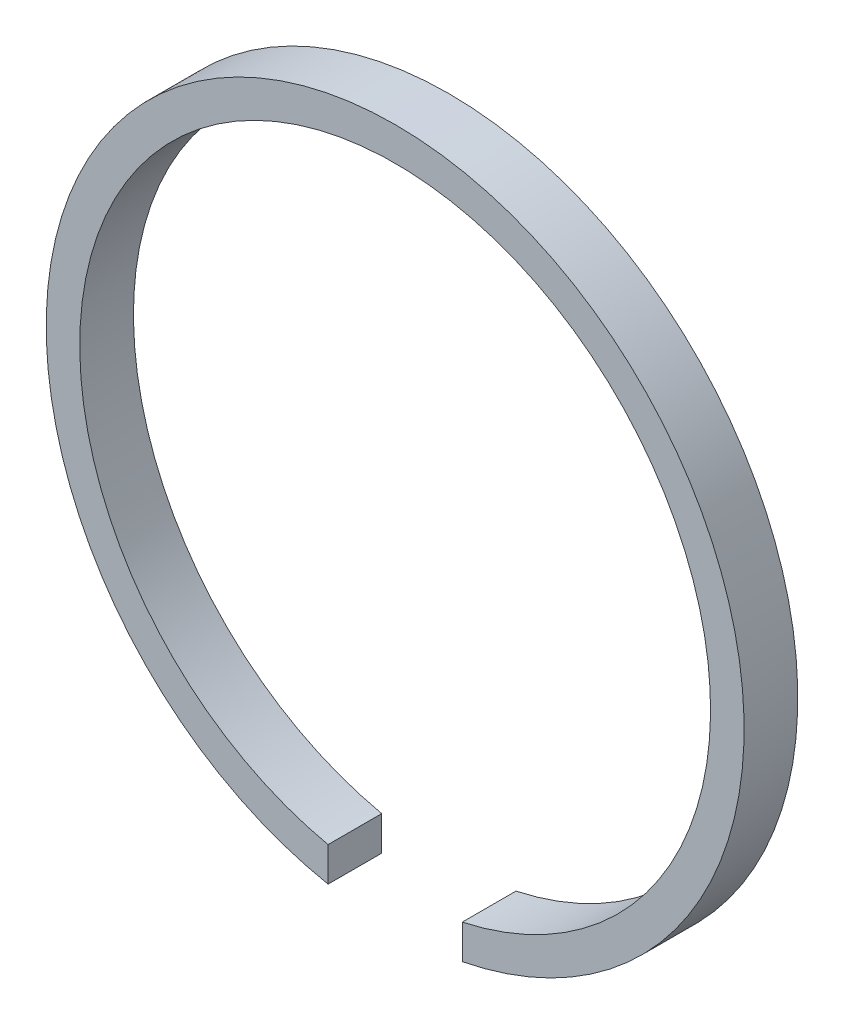
ISO-10303-21;
HEADER;
FILE_DESCRIPTION(('STEP AP214'),'2;1');
FILE_NAME('part.step','',(''),(''),'','','');
FILE_SCHEMA(('AUTOMOTIVE_DESIGN { 1 0 10303 214 1 1 1 1 }'));
ENDSEC;
DATA;
#1=APPLICATION_CONTEXT('core data for automotive mechanical design processes');
#2=APPLICATION_PROTOCOL_DEFINITION('international standard','automotive_design',2000,#1);
#3=PRODUCT_CONTEXT('',#1,'mechanical');
#4=PRODUCT('Part','Part','',(#3));
#5=PRODUCT_RELATED_PRODUCT_CATEGORY('part','',(#4));
#6=PRODUCT_DEFINITION_FORMATION('','',#4);
#7=PRODUCT_DEFINITION_CONTEXT('part definition',#1,'design');
#8=PRODUCT_DEFINITION('design','',#6,#7);
#9=PRODUCT_DEFINITION_SHAPE('','',#8);
#10=(LENGTH_UNIT() NAMED_UNIT(*) SI_UNIT(.MILLI.,.METRE.));
#11=(NAMED_UNIT(*) PLANE_ANGLE_UNIT() SI_UNIT($,.RADIAN.));
#12=(NAMED_UNIT(*) SI_UNIT($,.STERADIAN.) SOLID_ANGLE_UNIT());
#13=UNCERTAINTY_MEASURE_WITH_UNIT(LENGTH_MEASURE(1.E-05),#10,'distance_accuracy_value','');
#14=(GEOMETRIC_REPRESENTATION_CONTEXT(3) GLOBAL_UNCERTAINTY_ASSIGNED_CONTEXT((#13)) GLOBAL_UNIT_ASSIGNED_CONTEXT((#10,
#11,#12)) REPRESENTATION_CONTEXT('',''));
#15=CARTESIAN_POINT('',(0.,0.,0.));
#16=DIRECTION('',(0.,0.,1.));
#17=DIRECTION('',(1.,0.,0.));
#18=AXIS2_PLACEMENT_3D('',#15,#16,#17);
#19=CARTESIAN_POINT('',(0.,0.,4.));
#20=DIRECTION('',(0.,0.,-1.));
#21=DIRECTION('',(-1.,0.,0.));
#22=AXIS2_PLACEMENT_3D('',#19,#20,#21);
#23=CYLINDRICAL_SURFACE('',#22,23.5);
#24=CARTESIAN_POINT('',(0.,0.,0.));
#25=DIRECTION('',(0.,0.,1.));
#26=DIRECTION('',(1.,0.,0.));
#27=AXIS2_PLACEMENT_3D('',#24,#25,#26);
#28=CIRCLE('',#27,23.5);
#29=CARTESIAN_POINT('',(5.,-22.9619250064101,0.));
#30=VERTEX_POINT('',#29);
#31=CARTESIAN_POINT('',(-5.,-22.9619250064101,0.));
#32=VERTEX_POINT('',#31);
#33=EDGE_CURVE('E103',#30,#32,#28,.T.);
#34=ORIENTED_EDGE('',*,*,#33,.F.);
#35=DIRECTION('',(0.,0.,-1.));
#36=VECTOR('',#35,1.);
#37=CARTESIAN_POINT('',(5.,-22.9619250064101,4.));
#38=LINE('',#37,#36);
#39=CARTESIAN_POINT('',(5.,-22.9619250064101,4.));
#40=VERTEX_POINT('',#39);
#41=EDGE_CURVE('E11',#40,#30,#38,.T.);
#42=ORIENTED_EDGE('',*,*,#41,.F.);
#43=CARTESIAN_POINT('',(0.,0.,4.));
#44=DIRECTION('',(0.,0.,1.));
#45=DIRECTION('',(1.,0.,0.));
#46=AXIS2_PLACEMENT_3D('',#43,#44,#45);
#47=CIRCLE('',#46,23.5);
#48=CARTESIAN_POINT('',(-5.,-22.9619250064101,4.));
#49=VERTEX_POINT('',#48);
#50=EDGE_CURVE('E97',#40,#49,#47,.T.);
#51=ORIENTED_EDGE('',*,*,#50,.T.);
#52=DIRECTION('',(0.,0.,-1.));
#53=VECTOR('',#52,1.);
#54=CARTESIAN_POINT('',(-5.,-22.9619250064101,4.));
#55=LINE('',#54,#53);
#56=EDGE_CURVE('E55',#49,#32,#55,.T.);
#57=ORIENTED_EDGE('',*,*,#56,.T.);
#58=EDGE_LOOP('',(#34,#42,#51,#57));
#59=FACE_BOUND('',#58,.T.);
#60=ADVANCED_FACE('F39',(#59),#23,.F.);
#61=CARTESIAN_POINT('',(5.,0.,4.));
#62=DIRECTION('',(-1.,0.,0.));
#63=DIRECTION('',(0.,0.,1.));
#64=AXIS2_PLACEMENT_3D('',#61,#62,#63);
#65=PLANE('',#64);
#66=DIRECTION('',(0.,1.,0.));
#67=VECTOR('',#66,1.);
#68=CARTESIAN_POINT('',(5.,0.,0.));
#69=LINE('',#68,#67);
#70=CARTESIAN_POINT('',(5.,-25.5147016443461,0.));
#71=VERTEX_POINT('',#70);
#72=EDGE_CURVE('E87',#71,#30,#69,.T.);
#73=ORIENTED_EDGE('',*,*,#72,.F.);
#74=DIRECTION('',(0.,0.,-1.));
#75=VECTOR('',#74,1.);
#76=CARTESIAN_POINT('',(5.,-25.5147016443461,4.));
#77=LINE('',#76,#75);
#78=CARTESIAN_POINT('',(5.,-25.5147016443461,4.));
#79=VERTEX_POINT('',#78);
#80=EDGE_CURVE('E47',#79,#71,#77,.T.);
#81=ORIENTED_EDGE('',*,*,#80,.F.);
#82=DIRECTION('',(0.,1.,0.));
#83=VECTOR('',#82,1.);
#84=CARTESIAN_POINT('',(5.,0.,4.));
#85=LINE('',#84,#83);
#86=EDGE_CURVE('E85',#79,#40,#85,.T.);
#87=ORIENTED_EDGE('',*,*,#86,.T.);
#88=ORIENTED_EDGE('',*,*,#41,.T.);
#89=EDGE_LOOP('',(#73,#81,#87,#88));
#90=FACE_BOUND('',#89,.T.);
#91=ADVANCED_FACE('F83',(#90),#65,.T.);
#92=CARTESIAN_POINT('',(0.,0.,4.));
#93=DIRECTION('',(0.,0.,-1.));
#94=DIRECTION('',(-1.,0.,0.));
#95=AXIS2_PLACEMENT_3D('',#92,#93,#94);
#96=CYLINDRICAL_SURFACE('',#95,26.);
#97=CARTESIAN_POINT('',(0.,0.,0.));
#98=DIRECTION('',(0.,0.,1.));
#99=DIRECTION('',(1.,0.,0.));
#100=AXIS2_PLACEMENT_3D('',#97,#98,#99);
#101=CIRCLE('',#100,26.);
#102=CARTESIAN_POINT('',(-5.,-25.5147016443461,0.));
#103=VERTEX_POINT('',#102);
#104=EDGE_CURVE('E106',#71,#103,#101,.T.);
#105=ORIENTED_EDGE('',*,*,#104,.T.);
#106=DIRECTION('',(0.,0.,-1.));
#107=VECTOR('',#106,1.);
#108=CARTESIAN_POINT('',(-5.,-25.5147016443461,4.));
#109=LINE('',#108,#107);
#110=CARTESIAN_POINT('',(-5.,-25.5147016443461,4.));
#111=VERTEX_POINT('',#110);
#112=EDGE_CURVE('E69',#111,#103,#109,.T.);
#113=ORIENTED_EDGE('',*,*,#112,.F.);
#114=CARTESIAN_POINT('',(0.,0.,4.));
#115=DIRECTION('',(0.,0.,1.));
#116=DIRECTION('',(1.,0.,0.));
#117=AXIS2_PLACEMENT_3D('',#114,#115,#116);
#118=CIRCLE('',#117,26.);
#119=EDGE_CURVE('E90',#79,#111,#118,.T.);
#120=ORIENTED_EDGE('',*,*,#119,.F.);
#121=ORIENTED_EDGE('',*,*,#80,.T.);
#122=EDGE_LOOP('',(#105,#113,#120,#121));
#123=FACE_BOUND('',#122,.T.);
#124=ADVANCED_FACE('F91',(#123),#96,.T.);
#125=CARTESIAN_POINT('',(-5.,0.,4.));
#126=DIRECTION('',(1.,0.,0.));
#127=DIRECTION('',(0.,0.,-1.));
#128=AXIS2_PLACEMENT_3D('',#125,#126,#127);
#129=PLANE('',#128);
#130=DIRECTION('',(0.,-1.,0.));
#131=VECTOR('',#130,1.);
#132=CARTESIAN_POINT('',(-5.,0.,0.));
#133=LINE('',#132,#131);
#134=EDGE_CURVE('E99',#32,#103,#133,.T.);
#135=ORIENTED_EDGE('',*,*,#134,.F.);
#136=ORIENTED_EDGE('',*,*,#56,.F.);
#137=DIRECTION('',(0.,-1.,0.));
#138=VECTOR('',#137,1.);
#139=CARTESIAN_POINT('',(-5.,0.,4.));
#140=LINE('',#139,#138);
#141=EDGE_CURVE('E94',#49,#111,#140,.T.);
#142=ORIENTED_EDGE('',*,*,#141,.T.);
#143=ORIENTED_EDGE('',*,*,#112,.T.);
#144=EDGE_LOOP('',(#135,#136,#142,#143));
#145=FACE_BOUND('',#144,.T.);
#146=ADVANCED_FACE('F113',(#145),#129,.T.);
#147=CARTESIAN_POINT('',(0.,0.,4.));
#148=DIRECTION('',(0.,0.,1.));
#149=DIRECTION('',(1.,0.,0.));
#150=AXIS2_PLACEMENT_3D('',#147,#148,#149);
#151=PLANE('',#150);
#152=ORIENTED_EDGE('',*,*,#50,.F.);
#153=ORIENTED_EDGE('',*,*,#86,.F.);
#154=ORIENTED_EDGE('',*,*,#119,.T.);
#155=ORIENTED_EDGE('',*,*,#141,.F.);
#156=EDGE_LOOP('',(#152,#153,#154,#155));
#157=FACE_BOUND('',#156,.T.);
#158=ADVANCED_FACE('F96',(#157),#151,.T.);
#159=CARTESIAN_POINT('',(0.,0.,0.));
#160=DIRECTION('',(0.,0.,1.));
#161=DIRECTION('',(1.,0.,0.));
#162=AXIS2_PLACEMENT_3D('',#159,#160,#161);
#163=PLANE('',#162);
#164=ORIENTED_EDGE('',*,*,#33,.T.);
#165=ORIENTED_EDGE('',*,*,#134,.T.);
#166=ORIENTED_EDGE('',*,*,#104,.F.);
#167=ORIENTED_EDGE('',*,*,#72,.T.);
#168=EDGE_LOOP('',(#164,#165,#166,#167));
#169=FACE_BOUND('',#168,.T.);
#170=ADVANCED_FACE('F112',(#169),#163,.F.);
#171=CLOSED_SHELL('',(#60,#91,#124,#146,#158,#170));
#172=MANIFOLD_SOLID_BREP('B2',#171);
#173=ADVANCED_BREP_SHAPE_REPRESENTATION('',(#18,#172),#14);
#174=SHAPE_DEFINITION_REPRESENTATION(#9,#173);
ENDSEC;
END-ISO-10303-21;
